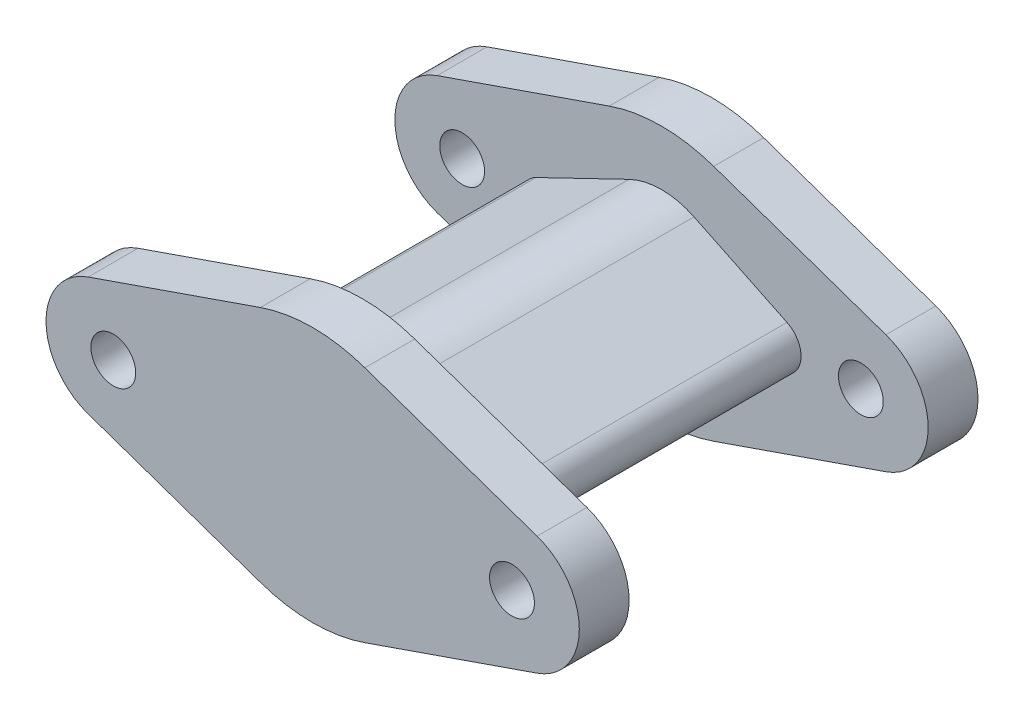
ISO-10303-21;
HEADER;
FILE_DESCRIPTION(('STEP AP214'),'2;1');
FILE_NAME('part.step','',(''),(''),'','','');
FILE_SCHEMA(('AUTOMOTIVE_DESIGN { 1 0 10303 214 1 1 1 1 }'));
ENDSEC;
DATA;
#1=APPLICATION_CONTEXT('core data for automotive mechanical design processes');
#2=APPLICATION_PROTOCOL_DEFINITION('international standard','automotive_design',2000,#1);
#3=PRODUCT_CONTEXT('',#1,'mechanical');
#4=PRODUCT('Part','Part','',(#3));
#5=PRODUCT_RELATED_PRODUCT_CATEGORY('part','',(#4));
#6=PRODUCT_DEFINITION_FORMATION('','',#4);
#7=PRODUCT_DEFINITION_CONTEXT('part definition',#1,'design');
#8=PRODUCT_DEFINITION('design','',#6,#7);
#9=PRODUCT_DEFINITION_SHAPE('','',#8);
#10=(LENGTH_UNIT() NAMED_UNIT(*) SI_UNIT(.MILLI.,.METRE.));
#11=(NAMED_UNIT(*) PLANE_ANGLE_UNIT() SI_UNIT($,.RADIAN.));
#12=(NAMED_UNIT(*) SI_UNIT($,.STERADIAN.) SOLID_ANGLE_UNIT());
#13=UNCERTAINTY_MEASURE_WITH_UNIT(LENGTH_MEASURE(1.E-05),#10,'distance_accuracy_value','');
#14=(GEOMETRIC_REPRESENTATION_CONTEXT(3) GLOBAL_UNCERTAINTY_ASSIGNED_CONTEXT((#13)) GLOBAL_UNIT_ASSIGNED_CONTEXT((#10,
#11,#12)) REPRESENTATION_CONTEXT('',''));
#15=CARTESIAN_POINT('',(0.,0.,0.));
#16=DIRECTION('',(0.,0.,1.));
#17=DIRECTION('',(1.,0.,0.));
#18=AXIS2_PLACEMENT_3D('',#15,#16,#17);
#19=CARTESIAN_POINT('',(0.,0.,40.));
#20=DIRECTION('',(0.,0.,-1.));
#21=DIRECTION('',(-1.,0.,0.));
#22=AXIS2_PLACEMENT_3D('',#19,#20,#21);
#23=PLANE('',#22);
#24=DIRECTION('',(0.944815710204536,-0.327602310356168,0.));
#25=VECTOR('',#24,1.);
#26=CARTESIAN_POINT('',(0.,-13.7592970349591,40.));
#27=LINE('',#26,#25);
#28=CARTESIAN_POINT('',(-22.5155207745943,-5.95233897428858,40.));
#29=VERTEX_POINT('',#28);
#30=CARTESIAN_POINT('',(-5.24163696569869,-11.9418289705897,40.));
#31=VERTEX_POINT('',#30);
#32=EDGE_CURVE('E178',#29,#31,#27,.T.);
#33=ORIENTED_EDGE('',*,*,#32,.T.);
#34=CARTESIAN_POINT('',(0.,3.17522239268286,40.));
#35=DIRECTION('',(0.,0.,-1.));
#36=DIRECTION('',(-1.,0.,0.));
#37=AXIS2_PLACEMENT_3D('',#34,#35,#36);
#38=CIRCLE('',#37,16.);
#39=CARTESIAN_POINT('',(5.24163696569869,-11.9418289705897,40.));
#40=VERTEX_POINT('',#39);
#41=EDGE_CURVE('E12',#31,#40,#38,.F.);
#42=ORIENTED_EDGE('',*,*,#41,.T.);
#43=DIRECTION('',(0.944815710204536,0.327602310356168,0.));
#44=VECTOR('',#43,1.);
#45=CARTESIAN_POINT('',(39.6822598285905,0.,40.));
#46=LINE('',#45,#44);
#47=CARTESIAN_POINT('',(22.5155207745943,-5.95233897428858,40.));
#48=VERTEX_POINT('',#47);
#49=EDGE_CURVE('E125',#40,#48,#46,.T.);
#50=ORIENTED_EDGE('',*,*,#49,.T.);
#51=CARTESIAN_POINT('',(20.4516262193505,0.,40.));
#52=DIRECTION('',(0.,0.,-1.));
#53=DIRECTION('',(-1.,0.,0.));
#54=AXIS2_PLACEMENT_3D('',#51,#52,#53);
#55=CIRCLE('',#54,6.3);
#56=CARTESIAN_POINT('',(22.5155207745943,5.95233897428857,40.));
#57=VERTEX_POINT('',#56);
#58=EDGE_CURVE('E146',#48,#57,#55,.F.);
#59=ORIENTED_EDGE('',*,*,#58,.T.);
#60=DIRECTION('',(-0.944815710204536,0.327602310356168,0.));
#61=VECTOR('',#60,1.);
#62=CARTESIAN_POINT('',(0.,13.7592970349591,40.));
#63=LINE('',#62,#61);
#64=CARTESIAN_POINT('',(5.24163696569869,11.9418289705897,40.));
#65=VERTEX_POINT('',#64);
#66=EDGE_CURVE('E124',#57,#65,#63,.T.);
#67=ORIENTED_EDGE('',*,*,#66,.T.);
#68=CARTESIAN_POINT('',(0.,-3.17522239268285,40.));
#69=DIRECTION('',(0.,0.,-1.));
#70=DIRECTION('',(-1.,0.,0.));
#71=AXIS2_PLACEMENT_3D('',#68,#69,#70);
#72=CIRCLE('',#71,16.);
#73=CARTESIAN_POINT('',(-5.24163696569869,11.9418289705897,40.));
#74=VERTEX_POINT('',#73);
#75=EDGE_CURVE('E165',#65,#74,#72,.F.);
#76=ORIENTED_EDGE('',*,*,#75,.T.);
#77=DIRECTION('',(-0.944815710204536,-0.327602310356168,0.));
#78=VECTOR('',#77,1.);
#79=CARTESIAN_POINT('',(-39.6822598285905,0.,40.));
#80=LINE('',#79,#78);
#81=CARTESIAN_POINT('',(-22.5155207745943,5.95233897428858,40.));
#82=VERTEX_POINT('',#81);
#83=EDGE_CURVE('E181',#74,#82,#80,.T.);
#84=ORIENTED_EDGE('',*,*,#83,.T.);
#85=CARTESIAN_POINT('',(-20.4516262193505,0.,40.));
#86=DIRECTION('',(0.,0.,-1.));
#87=DIRECTION('',(-1.,0.,0.));
#88=AXIS2_PLACEMENT_3D('',#85,#86,#87);
#89=CIRCLE('',#88,6.3);
#90=EDGE_CURVE('E157',#82,#29,#89,.F.);
#91=ORIENTED_EDGE('',*,*,#90,.T.);
#92=EDGE_LOOP('',(#33,#42,#50,#59,#67,#76,#84,#91));
#93=FACE_BOUND('',#92,.T.);
#94=CARTESIAN_POINT('',(20.,0.,40.));
#95=DIRECTION('',(0.,0.,-1.));
#96=DIRECTION('',(-1.,0.,0.));
#97=AXIS2_PLACEMENT_3D('',#94,#95,#96);
#98=CIRCLE('',#97,2.25);
#99=CARTESIAN_POINT('',(17.75,0.,40.));
#100=VERTEX_POINT('',#99);
#101=EDGE_CURVE('E188',#100,#100,#98,.T.);
#102=ORIENTED_EDGE('',*,*,#101,.T.);
#103=EDGE_LOOP('',(#102));
#104=FACE_BOUND('',#103,.T.);
#105=CARTESIAN_POINT('',(-20.,0.,40.));
#106=DIRECTION('',(0.,0.,1.));
#107=DIRECTION('',(1.,0.,0.));
#108=AXIS2_PLACEMENT_3D('',#105,#106,#107);
#109=CIRCLE('',#108,2.25);
#110=CARTESIAN_POINT('',(-17.75,0.,40.));
#111=VERTEX_POINT('',#110);
#112=EDGE_CURVE('E137',#111,#111,#109,.T.);
#113=ORIENTED_EDGE('',*,*,#112,.F.);
#114=EDGE_LOOP('',(#113));
#115=FACE_BOUND('',#114,.T.);
#116=ADVANCED_FACE('F42',(#93,#104,#115),#23,.F.);
#117=CARTESIAN_POINT('',(0.,0.,35.));
#118=DIRECTION('',(0.,0.,-1.));
#119=DIRECTION('',(-1.,0.,0.));
#120=AXIS2_PLACEMENT_3D('',#117,#118,#119);
#121=PLANE('',#120);
#122=CARTESIAN_POINT('',(20.,0.,35.));
#123=DIRECTION('',(0.,0.,-1.));
#124=DIRECTION('',(-1.,0.,0.));
#125=AXIS2_PLACEMENT_3D('',#122,#123,#124);
#126=CIRCLE('',#125,2.25);
#127=CARTESIAN_POINT('',(17.75,0.,35.));
#128=VERTEX_POINT('',#127);
#129=EDGE_CURVE('E185',#128,#128,#126,.T.);
#130=ORIENTED_EDGE('',*,*,#129,.F.);
#131=EDGE_LOOP('',(#130));
#132=FACE_BOUND('',#131,.T.);
#133=DIRECTION('',(0.944815710204536,0.327602310356168,0.));
#134=VECTOR('',#133,1.);
#135=CARTESIAN_POINT('',(39.6822598285905,0.,35.));
#136=LINE('',#135,#134);
#137=CARTESIAN_POINT('',(5.24163696569869,-11.9418289705897,35.));
#138=VERTEX_POINT('',#137);
#139=CARTESIAN_POINT('',(22.5155207745943,-5.95233897428858,35.));
#140=VERTEX_POINT('',#139);
#141=EDGE_CURVE('E143',#138,#140,#136,.T.);
#142=ORIENTED_EDGE('',*,*,#141,.F.);
#143=CARTESIAN_POINT('',(0.,3.17522239268286,35.));
#144=DIRECTION('',(0.,0.,-1.));
#145=DIRECTION('',(-1.,0.,0.));
#146=AXIS2_PLACEMENT_3D('',#143,#144,#145);
#147=CIRCLE('',#146,16.);
#148=CARTESIAN_POINT('',(-5.24163696569869,-11.9418289705897,35.));
#149=VERTEX_POINT('',#148);
#150=EDGE_CURVE('E64',#138,#149,#147,.T.);
#151=ORIENTED_EDGE('',*,*,#150,.T.);
#152=DIRECTION('',(0.944815710204536,-0.327602310356168,0.));
#153=VECTOR('',#152,1.);
#154=CARTESIAN_POINT('',(0.,-13.7592970349591,35.));
#155=LINE('',#154,#153);
#156=CARTESIAN_POINT('',(-22.5155207745943,-5.95233897428858,35.));
#157=VERTEX_POINT('',#156);
#158=EDGE_CURVE('E134',#157,#149,#155,.T.);
#159=ORIENTED_EDGE('',*,*,#158,.F.);
#160=CARTESIAN_POINT('',(-20.4516262193505,0.,35.));
#161=DIRECTION('',(0.,0.,-1.));
#162=DIRECTION('',(-1.,0.,0.));
#163=AXIS2_PLACEMENT_3D('',#160,#161,#162);
#164=CIRCLE('',#163,6.3);
#165=CARTESIAN_POINT('',(-22.5155207745943,5.95233897428858,35.));
#166=VERTEX_POINT('',#165);
#167=EDGE_CURVE('E151',#157,#166,#164,.T.);
#168=ORIENTED_EDGE('',*,*,#167,.T.);
#169=DIRECTION('',(-0.944815710204536,-0.327602310356168,0.));
#170=VECTOR('',#169,1.);
#171=CARTESIAN_POINT('',(-39.6822598285905,0.,35.));
#172=LINE('',#171,#170);
#173=CARTESIAN_POINT('',(-5.24163696569869,11.9418289705897,35.));
#174=VERTEX_POINT('',#173);
#175=EDGE_CURVE('E131',#174,#166,#172,.T.);
#176=ORIENTED_EDGE('',*,*,#175,.F.);
#177=CARTESIAN_POINT('',(0.,-3.17522239268285,35.));
#178=DIRECTION('',(0.,0.,-1.));
#179=DIRECTION('',(-1.,0.,0.));
#180=AXIS2_PLACEMENT_3D('',#177,#178,#179);
#181=CIRCLE('',#180,16.);
#182=CARTESIAN_POINT('',(5.24163696569869,11.9418289705897,35.));
#183=VERTEX_POINT('',#182);
#184=EDGE_CURVE('E130',#174,#183,#181,.T.);
#185=ORIENTED_EDGE('',*,*,#184,.T.);
#186=DIRECTION('',(-0.944815710204536,0.327602310356168,0.));
#187=VECTOR('',#186,1.);
#188=CARTESIAN_POINT('',(0.,13.7592970349591,35.));
#189=LINE('',#188,#187);
#190=CARTESIAN_POINT('',(22.5155207745943,5.95233897428857,35.));
#191=VERTEX_POINT('',#190);
#192=EDGE_CURVE('E121',#191,#183,#189,.T.);
#193=ORIENTED_EDGE('',*,*,#192,.F.);
#194=CARTESIAN_POINT('',(20.4516262193505,0.,35.));
#195=DIRECTION('',(0.,0.,-1.));
#196=DIRECTION('',(-1.,0.,0.));
#197=AXIS2_PLACEMENT_3D('',#194,#195,#196);
#198=CIRCLE('',#197,6.3);
#199=EDGE_CURVE('E108',#191,#140,#198,.T.);
#200=ORIENTED_EDGE('',*,*,#199,.T.);
#201=EDGE_LOOP('',(#142,#151,#159,#168,#176,#185,#193,#200));
#202=FACE_BOUND('',#201,.T.);
#203=CARTESIAN_POINT('',(-20.,0.,35.));
#204=DIRECTION('',(0.,0.,1.));
#205=DIRECTION('',(1.,0.,0.));
#206=AXIS2_PLACEMENT_3D('',#203,#204,#205);
#207=CIRCLE('',#206,2.25);
#208=CARTESIAN_POINT('',(-17.75,0.,35.));
#209=VERTEX_POINT('',#208);
#210=EDGE_CURVE('E132',#209,#209,#207,.T.);
#211=ORIENTED_EDGE('',*,*,#210,.T.);
#212=EDGE_LOOP('',(#211));
#213=FACE_BOUND('',#212,.T.);
#214=ADVANCED_FACE('F127',(#132,#202,#213),#121,.T.);
#215=CARTESIAN_POINT('',(0.,13.7592970349591,40.));
#216=DIRECTION('',(-0.327602310356168,-0.944815710204535,0.));
#217=DIRECTION('',(0.944815710204536,-0.327602310356168,0.));
#218=AXIS2_PLACEMENT_3D('',#215,#216,#217);
#219=PLANE('',#218);
#220=ORIENTED_EDGE('',*,*,#192,.T.);
#221=DIRECTION('',(0.,0.,-1.));
#222=VECTOR('',#221,1.);
#223=CARTESIAN_POINT('',(5.24163696569869,11.9418289705897,40.));
#224=LINE('',#223,#222);
#225=EDGE_CURVE('E163',#183,#65,#224,.F.);
#226=ORIENTED_EDGE('',*,*,#225,.T.);
#227=ORIENTED_EDGE('',*,*,#66,.F.);
#228=DIRECTION('',(0.,0.,-1.));
#229=VECTOR('',#228,1.);
#230=CARTESIAN_POINT('',(22.5155207745943,5.95233897428857,40.));
#231=LINE('',#230,#229);
#232=EDGE_CURVE('E112',#57,#191,#231,.T.);
#233=ORIENTED_EDGE('',*,*,#232,.T.);
#234=EDGE_LOOP('',(#220,#226,#227,#233));
#235=FACE_BOUND('',#234,.T.);
#236=ADVANCED_FACE('F120',(#235),#219,.F.);
#237=CARTESIAN_POINT('',(-39.6822598285905,0.,40.));
#238=DIRECTION('',(0.327602310356168,-0.944815710204535,0.));
#239=DIRECTION('',(0.944815710204536,0.327602310356168,0.));
#240=AXIS2_PLACEMENT_3D('',#237,#238,#239);
#241=PLANE('',#240);
#242=ORIENTED_EDGE('',*,*,#83,.F.);
#243=DIRECTION('',(0.,0.,-1.));
#244=VECTOR('',#243,1.);
#245=CARTESIAN_POINT('',(-5.24163696569869,11.9418289705897,40.));
#246=LINE('',#245,#244);
#247=EDGE_CURVE('E159',#74,#174,#246,.T.);
#248=ORIENTED_EDGE('',*,*,#247,.T.);
#249=ORIENTED_EDGE('',*,*,#175,.T.);
#250=DIRECTION('',(0.,0.,-1.));
#251=VECTOR('',#250,1.);
#252=CARTESIAN_POINT('',(-22.5155207745943,5.95233897428858,40.));
#253=LINE('',#252,#251);
#254=EDGE_CURVE('E154',#166,#82,#253,.F.);
#255=ORIENTED_EDGE('',*,*,#254,.T.);
#256=EDGE_LOOP('',(#242,#248,#249,#255));
#257=FACE_BOUND('',#256,.T.);
#258=ADVANCED_FACE('F212',(#257),#241,.F.);
#259=CARTESIAN_POINT('',(0.,-13.7592970349591,40.));
#260=DIRECTION('',(0.327602310356168,0.944815710204536,0.));
#261=DIRECTION('',(-0.944815710204536,0.327602310356168,0.));
#262=AXIS2_PLACEMENT_3D('',#259,#260,#261);
#263=PLANE('',#262);
#264=ORIENTED_EDGE('',*,*,#158,.T.);
#265=DIRECTION('',(0.,0.,-1.));
#266=VECTOR('',#265,1.);
#267=CARTESIAN_POINT('',(-5.24163696569869,-11.9418289705897,40.));
#268=LINE('',#267,#266);
#269=EDGE_CURVE('E50',#149,#31,#268,.F.);
#270=ORIENTED_EDGE('',*,*,#269,.T.);
#271=ORIENTED_EDGE('',*,*,#32,.F.);
#272=DIRECTION('',(0.,0.,-1.));
#273=VECTOR('',#272,1.);
#274=CARTESIAN_POINT('',(-22.5155207745943,-5.95233897428858,40.));
#275=LINE('',#274,#273);
#276=EDGE_CURVE('E148',#29,#157,#275,.T.);
#277=ORIENTED_EDGE('',*,*,#276,.T.);
#278=EDGE_LOOP('',(#264,#270,#271,#277));
#279=FACE_BOUND('',#278,.T.);
#280=ADVANCED_FACE('F209',(#279),#263,.F.);
#281=CARTESIAN_POINT('',(39.6822598285905,0.,40.));
#282=DIRECTION('',(-0.327602310356168,0.944815710204536,0.));
#283=DIRECTION('',(-0.944815710204536,-0.327602310356168,0.));
#284=AXIS2_PLACEMENT_3D('',#281,#282,#283);
#285=PLANE('',#284);
#286=ORIENTED_EDGE('',*,*,#49,.F.);
#287=DIRECTION('',(0.,0.,-1.));
#288=VECTOR('',#287,1.);
#289=CARTESIAN_POINT('',(5.24163696569868,-11.9418289705897,40.));
#290=LINE('',#289,#288);
#291=EDGE_CURVE('E167',#40,#138,#290,.T.);
#292=ORIENTED_EDGE('',*,*,#291,.T.);
#293=ORIENTED_EDGE('',*,*,#141,.T.);
#294=DIRECTION('',(0.,0.,-1.));
#295=VECTOR('',#294,1.);
#296=CARTESIAN_POINT('',(22.5155207745943,-5.95233897428858,40.));
#297=LINE('',#296,#295);
#298=EDGE_CURVE('E114',#140,#48,#297,.F.);
#299=ORIENTED_EDGE('',*,*,#298,.T.);
#300=EDGE_LOOP('',(#286,#292,#293,#299));
#301=FACE_BOUND('',#300,.T.);
#302=ADVANCED_FACE('F173',(#301),#285,.F.);
#303=CARTESIAN_POINT('',(20.4516262193505,0.,40.));
#304=DIRECTION('',(0.,0.,-1.));
#305=DIRECTION('',(-1.,0.,0.));
#306=AXIS2_PLACEMENT_3D('',#303,#304,#305);
#307=CYLINDRICAL_SURFACE('',#306,6.3);
#308=ORIENTED_EDGE('',*,*,#58,.F.);
#309=ORIENTED_EDGE('',*,*,#298,.F.);
#310=ORIENTED_EDGE('',*,*,#199,.F.);
#311=ORIENTED_EDGE('',*,*,#232,.F.);
#312=EDGE_LOOP('',(#308,#309,#310,#311));
#313=FACE_BOUND('',#312,.T.);
#314=ADVANCED_FACE('F111',(#313),#307,.T.);
#315=CARTESIAN_POINT('',(-20.4516262193505,0.,40.));
#316=DIRECTION('',(0.,0.,-1.));
#317=DIRECTION('',(-1.,0.,0.));
#318=AXIS2_PLACEMENT_3D('',#315,#316,#317);
#319=CYLINDRICAL_SURFACE('',#318,6.3);
#320=ORIENTED_EDGE('',*,*,#90,.F.);
#321=ORIENTED_EDGE('',*,*,#254,.F.);
#322=ORIENTED_EDGE('',*,*,#167,.F.);
#323=ORIENTED_EDGE('',*,*,#276,.F.);
#324=EDGE_LOOP('',(#320,#321,#322,#323));
#325=FACE_BOUND('',#324,.T.);
#326=ADVANCED_FACE('F220',(#325),#319,.T.);
#327=CARTESIAN_POINT('',(0.,-3.17522239268285,40.));
#328=DIRECTION('',(0.,0.,-1.));
#329=DIRECTION('',(-1.,0.,0.));
#330=AXIS2_PLACEMENT_3D('',#327,#328,#329);
#331=CYLINDRICAL_SURFACE('',#330,16.);
#332=ORIENTED_EDGE('',*,*,#75,.F.);
#333=ORIENTED_EDGE('',*,*,#225,.F.);
#334=ORIENTED_EDGE('',*,*,#184,.F.);
#335=ORIENTED_EDGE('',*,*,#247,.F.);
#336=EDGE_LOOP('',(#332,#333,#334,#335));
#337=FACE_BOUND('',#336,.T.);
#338=ADVANCED_FACE('F222',(#337),#331,.T.);
#339=CARTESIAN_POINT('',(0.,3.17522239268286,40.));
#340=DIRECTION('',(0.,0.,-1.));
#341=DIRECTION('',(-1.,0.,0.));
#342=AXIS2_PLACEMENT_3D('',#339,#340,#341);
#343=CYLINDRICAL_SURFACE('',#342,16.);
#344=ORIENTED_EDGE('',*,*,#41,.F.);
#345=ORIENTED_EDGE('',*,*,#269,.F.);
#346=ORIENTED_EDGE('',*,*,#150,.F.);
#347=ORIENTED_EDGE('',*,*,#291,.F.);
#348=EDGE_LOOP('',(#344,#345,#346,#347));
#349=FACE_BOUND('',#348,.T.);
#350=ADVANCED_FACE('F44',(#349),#343,.T.);
#351=CARTESIAN_POINT('',(20.,0.,35.));
#352=DIRECTION('',(0.,0.,1.));
#353=DIRECTION('',(1.,0.,0.));
#354=AXIS2_PLACEMENT_3D('',#351,#352,#353);
#355=CYLINDRICAL_SURFACE('',#354,2.25);
#356=ORIENTED_EDGE('',*,*,#129,.T.);
#357=EDGE_LOOP('',(#356));
#358=FACE_BOUND('',#357,.T.);
#359=ORIENTED_EDGE('',*,*,#101,.F.);
#360=EDGE_LOOP('',(#359));
#361=FACE_BOUND('',#360,.T.);
#362=ADVANCED_FACE('F204',(#358,#361),#355,.F.);
#363=CARTESIAN_POINT('',(-20.,0.,35.));
#364=DIRECTION('',(0.,0.,1.));
#365=DIRECTION('',(1.,0.,0.));
#366=AXIS2_PLACEMENT_3D('',#363,#364,#365);
#367=CYLINDRICAL_SURFACE('',#366,2.25);
#368=ORIENTED_EDGE('',*,*,#210,.F.);
#369=EDGE_LOOP('',(#368));
#370=FACE_BOUND('',#369,.T.);
#371=ORIENTED_EDGE('',*,*,#112,.T.);
#372=EDGE_LOOP('',(#371));
#373=FACE_BOUND('',#372,.T.);
#374=ADVANCED_FACE('F194',(#370,#373),#367,.F.);
#375=CLOSED_SHELL('',(#116,#214,#236,#258,#280,#302,#314,#326,#338,#350,#362,#374));
#376=MANIFOLD_SOLID_BREP('B2',#375);
#377=CARTESIAN_POINT('',(0.,0.,5.));
#378=DIRECTION('',(0.,0.,-1.));
#379=DIRECTION('',(-1.,0.,0.));
#380=AXIS2_PLACEMENT_3D('',#377,#378,#379);
#381=PLANE('',#380);
#382=CARTESIAN_POINT('',(-20.,0.,5.));
#383=DIRECTION('',(0.,0.,1.));
#384=DIRECTION('',(1.,0.,0.));
#385=AXIS2_PLACEMENT_3D('',#382,#383,#384);
#386=CIRCLE('',#385,2.25);
#387=CARTESIAN_POINT('',(-17.75,0.,5.));
#388=VERTEX_POINT('',#387);
#389=EDGE_CURVE('E460',#388,#388,#386,.T.);
#390=ORIENTED_EDGE('',*,*,#389,.F.);
#391=EDGE_LOOP('',(#390));
#392=FACE_BOUND('',#391,.T.);
#393=CARTESIAN_POINT('',(20.,0.,5.));
#394=DIRECTION('',(0.,0.,-1.));
#395=DIRECTION('',(-1.,0.,0.));
#396=AXIS2_PLACEMENT_3D('',#393,#394,#395);
#397=CIRCLE('',#396,2.25);
#398=CARTESIAN_POINT('',(17.75,0.,5.));
#399=VERTEX_POINT('',#398);
#400=EDGE_CURVE('E463',#399,#399,#397,.T.);
#401=ORIENTED_EDGE('',*,*,#400,.T.);
#402=EDGE_LOOP('',(#401));
#403=FACE_BOUND('',#402,.T.);
#404=DIRECTION('',(0.944815710204536,-0.327602310356168,0.));
#405=VECTOR('',#404,1.);
#406=CARTESIAN_POINT('',(0.,-13.7592970349591,5.));
#407=LINE('',#406,#405);
#408=CARTESIAN_POINT('',(-22.5155207745943,-5.95233897428858,5.));
#409=VERTEX_POINT('',#408);
#410=CARTESIAN_POINT('',(-5.24163696569869,-11.9418289705897,5.));
#411=VERTEX_POINT('',#410);
#412=EDGE_CURVE('E475',#409,#411,#407,.T.);
#413=ORIENTED_EDGE('',*,*,#412,.T.);
#414=CARTESIAN_POINT('',(0.,3.17522239268286,5.));
#415=DIRECTION('',(0.,0.,-1.));
#416=DIRECTION('',(-1.,0.,0.));
#417=AXIS2_PLACEMENT_3D('',#414,#415,#416);
#418=CIRCLE('',#417,16.);
#419=CARTESIAN_POINT('',(5.24163696569869,-11.9418289705897,5.));
#420=VERTEX_POINT('',#419);
#421=EDGE_CURVE('E40',#411,#420,#418,.F.);
#422=ORIENTED_EDGE('',*,*,#421,.T.);
#423=DIRECTION('',(0.944815710204536,0.327602310356168,0.));
#424=VECTOR('',#423,1.);
#425=CARTESIAN_POINT('',(39.6822598285905,0.,5.));
#426=LINE('',#425,#424);
#427=CARTESIAN_POINT('',(22.5155207745943,-5.95233897428858,5.));
#428=VERTEX_POINT('',#427);
#429=EDGE_CURVE('E478',#420,#428,#426,.T.);
#430=ORIENTED_EDGE('',*,*,#429,.T.);
#431=CARTESIAN_POINT('',(20.4516262193505,0.,5.));
#432=DIRECTION('',(0.,0.,-1.));
#433=DIRECTION('',(-1.,0.,0.));
#434=AXIS2_PLACEMENT_3D('',#431,#432,#433);
#435=CIRCLE('',#434,6.3);
#436=CARTESIAN_POINT('',(22.5155207745943,5.95233897428857,5.));
#437=VERTEX_POINT('',#436);
#438=EDGE_CURVE('E497',#428,#437,#435,.F.);
#439=ORIENTED_EDGE('',*,*,#438,.T.);
#440=DIRECTION('',(-0.944815710204536,0.327602310356168,0.));
#441=VECTOR('',#440,1.);
#442=CARTESIAN_POINT('',(0.,13.7592970349591,5.));
#443=LINE('',#442,#441);
#444=CARTESIAN_POINT('',(5.24163696569869,11.9418289705897,5.));
#445=VERTEX_POINT('',#444);
#446=EDGE_CURVE('E469',#437,#445,#443,.T.);
#447=ORIENTED_EDGE('',*,*,#446,.T.);
#448=CARTESIAN_POINT('',(0.,-3.17522239268285,5.));
#449=DIRECTION('',(0.,0.,-1.));
#450=DIRECTION('',(-1.,0.,0.));
#451=AXIS2_PLACEMENT_3D('',#448,#449,#450);
#452=CIRCLE('',#451,16.);
#453=CARTESIAN_POINT('',(-5.24163696569869,11.9418289705897,5.));
#454=VERTEX_POINT('',#453);
#455=EDGE_CURVE('E517',#445,#454,#452,.F.);
#456=ORIENTED_EDGE('',*,*,#455,.T.);
#457=DIRECTION('',(-0.944815710204536,-0.327602310356168,0.));
#458=VECTOR('',#457,1.);
#459=CARTESIAN_POINT('',(-39.6822598285905,0.,5.));
#460=LINE('',#459,#458);
#461=CARTESIAN_POINT('',(-22.5155207745943,5.95233897428858,5.));
#462=VERTEX_POINT('',#461);
#463=EDGE_CURVE('E472',#454,#462,#460,.T.);
#464=ORIENTED_EDGE('',*,*,#463,.T.);
#465=CARTESIAN_POINT('',(-20.4516262193505,0.,5.));
#466=DIRECTION('',(0.,0.,-1.));
#467=DIRECTION('',(-1.,0.,0.));
#468=AXIS2_PLACEMENT_3D('',#465,#466,#467);
#469=CIRCLE('',#468,6.3);
#470=EDGE_CURVE('E508',#462,#409,#469,.F.);
#471=ORIENTED_EDGE('',*,*,#470,.T.);
#472=EDGE_LOOP('',(#413,#422,#430,#439,#447,#456,#464,#471));
#473=FACE_BOUND('',#472,.T.);
#474=CARTESIAN_POINT('',(0.,-0.189162231974294,5.));
#475=DIRECTION('',(0.,0.,1.));
#476=DIRECTION('',(1.,0.,0.));
#477=AXIS2_PLACEMENT_3D('',#474,#475,#476);
#478=CIRCLE('',#477,7.5);
#479=CARTESIAN_POINT('',(-3.26086956521739,-6.94317805062907,5.));
#480=VERTEX_POINT('',#479);
#481=CARTESIAN_POINT('',(3.26086956521739,-6.94317805062907,5.));
#482=VERTEX_POINT('',#481);
#483=EDGE_CURVE('E326',#480,#482,#478,.T.);
#484=ORIENTED_EDGE('',*,*,#483,.F.);
#485=DIRECTION('',(-0.900535442487303,0.434782608695652,0.));
#486=VECTOR('',#485,1.);
#487=CARTESIAN_POINT('',(-3.26086956521739,-6.94317805062907,5.));
#488=LINE('',#487,#486);
#489=CARTESIAN_POINT('',(-12.5869565217391,-2.44050083819256,5.));
#490=VERTEX_POINT('',#489);
#491=EDGE_CURVE('E331',#480,#490,#488,.T.);
#492=ORIENTED_EDGE('',*,*,#491,.T.);
#493=CARTESIAN_POINT('',(-11.5,-0.189162231974294,5.));
#494=DIRECTION('',(0.,0.,1.));
#495=DIRECTION('',(1.,0.,0.));
#496=AXIS2_PLACEMENT_3D('',#493,#494,#495);
#497=CIRCLE('',#496,2.5);
#498=CARTESIAN_POINT('',(-12.5869565217391,2.06217637424397,5.));
#499=VERTEX_POINT('',#498);
#500=EDGE_CURVE('E446',#499,#490,#497,.T.);
#501=ORIENTED_EDGE('',*,*,#500,.F.);
#502=DIRECTION('',(-0.900535442487303,-0.434782608695652,0.));
#503=VECTOR('',#502,1.);
#504=CARTESIAN_POINT('',(-3.26086956521739,6.56485358668048,5.));
#505=LINE('',#504,#503);
#506=CARTESIAN_POINT('',(-3.26086956521739,6.56485358668048,5.));
#507=VERTEX_POINT('',#506);
#508=EDGE_CURVE('E744',#507,#499,#505,.T.);
#509=ORIENTED_EDGE('',*,*,#508,.F.);
#510=CARTESIAN_POINT('',(0.,-0.189162231974294,5.));
#511=DIRECTION('',(0.,0.,1.));
#512=DIRECTION('',(1.,0.,0.));
#513=AXIS2_PLACEMENT_3D('',#510,#511,#512);
#514=CIRCLE('',#513,7.5);
#515=CARTESIAN_POINT('',(3.26086956521739,6.56485358668049,5.));
#516=VERTEX_POINT('',#515);
#517=EDGE_CURVE('E746',#516,#507,#514,.T.);
#518=ORIENTED_EDGE('',*,*,#517,.F.);
#519=DIRECTION('',(0.900535442487303,-0.434782608695652,0.));
#520=VECTOR('',#519,1.);
#521=CARTESIAN_POINT('',(3.26086956521739,6.56485358668048,5.));
#522=LINE('',#521,#520);
#523=CARTESIAN_POINT('',(12.5869565217391,2.06217637424397,5.));
#524=VERTEX_POINT('',#523);
#525=EDGE_CURVE('E768',#516,#524,#522,.T.);
#526=ORIENTED_EDGE('',*,*,#525,.T.);
#527=CARTESIAN_POINT('',(11.5,-0.189162231974291,5.));
#528=DIRECTION('',(0.,0.,-1.));
#529=DIRECTION('',(-1.,0.,0.));
#530=AXIS2_PLACEMENT_3D('',#527,#528,#529);
#531=CIRCLE('',#530,2.5);
#532=CARTESIAN_POINT('',(12.5869565217391,-2.44050083819255,5.));
#533=VERTEX_POINT('',#532);
#534=EDGE_CURVE('E769',#524,#533,#531,.T.);
#535=ORIENTED_EDGE('',*,*,#534,.T.);
#536=DIRECTION('',(0.900535442487303,0.434782608695652,0.));
#537=VECTOR('',#536,1.);
#538=CARTESIAN_POINT('',(3.26086956521739,-6.94317805062907,5.));
#539=LINE('',#538,#537);
#540=EDGE_CURVE('E773',#482,#533,#539,.T.);
#541=ORIENTED_EDGE('',*,*,#540,.F.);
#542=EDGE_LOOP('',(#484,#492,#501,#509,#518,#526,#535,#541));
#543=FACE_BOUND('',#542,.T.);
#544=ADVANCED_FACE('F311',(#392,#403,#473,#543),#381,.F.);
#545=CARTESIAN_POINT('',(0.,0.,0.));
#546=DIRECTION('',(0.,0.,-1.));
#547=DIRECTION('',(-1.,0.,0.));
#548=AXIS2_PLACEMENT_3D('',#545,#546,#547);
#549=PLANE('',#548);
#550=CARTESIAN_POINT('',(20.,0.,0.));
#551=DIRECTION('',(0.,0.,-1.));
#552=DIRECTION('',(-1.,0.,0.));
#553=AXIS2_PLACEMENT_3D('',#550,#551,#552);
#554=CIRCLE('',#553,2.25);
#555=CARTESIAN_POINT('',(17.75,0.,0.));
#556=VERTEX_POINT('',#555);
#557=EDGE_CURVE('E466',#556,#556,#554,.T.);
#558=ORIENTED_EDGE('',*,*,#557,.F.);
#559=EDGE_LOOP('',(#558));
#560=FACE_BOUND('',#559,.T.);
#561=DIRECTION('',(0.944815710204536,0.327602310356168,0.));
#562=VECTOR('',#561,1.);
#563=CARTESIAN_POINT('',(39.6822598285905,0.,0.));
#564=LINE('',#563,#562);
#565=CARTESIAN_POINT('',(5.24163696569869,-11.9418289705897,0.));
#566=VERTEX_POINT('',#565);
#567=CARTESIAN_POINT('',(22.5155207745943,-5.95233897428858,0.));
#568=VERTEX_POINT('',#567);
#569=EDGE_CURVE('E473',#566,#568,#564,.T.);
#570=ORIENTED_EDGE('',*,*,#569,.F.);
#571=CARTESIAN_POINT('',(0.,3.17522239268286,0.));
#572=DIRECTION('',(0.,0.,-1.));
#573=DIRECTION('',(-1.,0.,0.));
#574=AXIS2_PLACEMENT_3D('',#571,#572,#573);
#575=CIRCLE('',#574,16.);
#576=CARTESIAN_POINT('',(-5.24163696569869,-11.9418289705897,0.));
#577=VERTEX_POINT('',#576);
#578=EDGE_CURVE('E522',#566,#577,#575,.T.);
#579=ORIENTED_EDGE('',*,*,#578,.T.);
#580=DIRECTION('',(0.944815710204536,-0.327602310356168,0.));
#581=VECTOR('',#580,1.);
#582=CARTESIAN_POINT('',(0.,-13.7592970349591,0.));
#583=LINE('',#582,#581);
#584=CARTESIAN_POINT('',(-22.5155207745943,-5.95233897428858,0.));
#585=VERTEX_POINT('',#584);
#586=EDGE_CURVE('E485',#585,#577,#583,.T.);
#587=ORIENTED_EDGE('',*,*,#586,.F.);
#588=CARTESIAN_POINT('',(-20.4516262193505,0.,0.));
#589=DIRECTION('',(0.,0.,-1.));
#590=DIRECTION('',(-1.,0.,0.));
#591=AXIS2_PLACEMENT_3D('',#588,#589,#590);
#592=CIRCLE('',#591,6.3);
#593=CARTESIAN_POINT('',(-22.5155207745943,5.95233897428858,0.));
#594=VERTEX_POINT('',#593);
#595=EDGE_CURVE('E502',#585,#594,#592,.T.);
#596=ORIENTED_EDGE('',*,*,#595,.T.);
#597=DIRECTION('',(-0.944815710204536,-0.327602310356168,0.));
#598=VECTOR('',#597,1.);
#599=CARTESIAN_POINT('',(-39.6822598285905,0.,0.));
#600=LINE('',#599,#598);
#601=CARTESIAN_POINT('',(-5.24163696569869,11.9418289705897,0.));
#602=VERTEX_POINT('',#601);
#603=EDGE_CURVE('E483',#602,#594,#600,.T.);
#604=ORIENTED_EDGE('',*,*,#603,.F.);
#605=CARTESIAN_POINT('',(0.,-3.17522239268285,0.));
#606=DIRECTION('',(0.,0.,-1.));
#607=DIRECTION('',(-1.,0.,0.));
#608=AXIS2_PLACEMENT_3D('',#605,#606,#607);
#609=CIRCLE('',#608,16.);
#610=CARTESIAN_POINT('',(5.24163696569869,11.9418289705897,0.));
#611=VERTEX_POINT('',#610);
#612=EDGE_CURVE('E513',#602,#611,#609,.T.);
#613=ORIENTED_EDGE('',*,*,#612,.T.);
#614=DIRECTION('',(-0.944815710204536,0.327602310356168,0.));
#615=VECTOR('',#614,1.);
#616=CARTESIAN_POINT('',(0.,13.7592970349591,0.));
#617=LINE('',#616,#615);
#618=CARTESIAN_POINT('',(22.5155207745943,5.95233897428857,0.));
#619=VERTEX_POINT('',#618);
#620=EDGE_CURVE('E459',#619,#611,#617,.T.);
#621=ORIENTED_EDGE('',*,*,#620,.F.);
#622=CARTESIAN_POINT('',(20.4516262193505,0.,0.));
#623=DIRECTION('',(0.,0.,-1.));
#624=DIRECTION('',(-1.,0.,0.));
#625=AXIS2_PLACEMENT_3D('',#622,#623,#624);
#626=CIRCLE('',#625,6.3);
#627=EDGE_CURVE('E491',#619,#568,#626,.T.);
#628=ORIENTED_EDGE('',*,*,#627,.T.);
#629=EDGE_LOOP('',(#570,#579,#587,#596,#604,#613,#621,#628));
#630=FACE_BOUND('',#629,.T.);
#631=CARTESIAN_POINT('',(-20.,0.,0.));
#632=DIRECTION('',(0.,0.,1.));
#633=DIRECTION('',(1.,0.,0.));
#634=AXIS2_PLACEMENT_3D('',#631,#632,#633);
#635=CIRCLE('',#634,2.25);
#636=CARTESIAN_POINT('',(-17.75,0.,0.));
#637=VERTEX_POINT('',#636);
#638=EDGE_CURVE('E456',#637,#637,#635,.T.);
#639=ORIENTED_EDGE('',*,*,#638,.T.);
#640=EDGE_LOOP('',(#639));
#641=FACE_BOUND('',#640,.T.);
#642=ADVANCED_FACE('F539',(#560,#630,#641),#549,.T.);
#643=CARTESIAN_POINT('',(0.,13.7592970349591,5.));
#644=DIRECTION('',(-0.327602310356168,-0.944815710204535,0.));
#645=DIRECTION('',(0.944815710204536,-0.327602310356168,0.));
#646=AXIS2_PLACEMENT_3D('',#643,#644,#645);
#647=PLANE('',#646);
#648=ORIENTED_EDGE('',*,*,#620,.T.);
#649=DIRECTION('',(0.,0.,-1.));
#650=VECTOR('',#649,1.);
#651=CARTESIAN_POINT('',(5.24163696569869,11.9418289705897,5.));
#652=LINE('',#651,#650);
#653=EDGE_CURVE('E515',#611,#445,#652,.F.);
#654=ORIENTED_EDGE('',*,*,#653,.T.);
#655=ORIENTED_EDGE('',*,*,#446,.F.);
#656=DIRECTION('',(0.,0.,-1.));
#657=VECTOR('',#656,1.);
#658=CARTESIAN_POINT('',(22.5155207745943,5.95233897428857,5.));
#659=LINE('',#658,#657);
#660=EDGE_CURVE('E480',#437,#619,#659,.T.);
#661=ORIENTED_EDGE('',*,*,#660,.T.);
#662=EDGE_LOOP('',(#648,#654,#655,#661));
#663=FACE_BOUND('',#662,.T.);
#664=ADVANCED_FACE('F550',(#663),#647,.F.);
#665=CARTESIAN_POINT('',(-39.6822598285905,0.,5.));
#666=DIRECTION('',(0.327602310356168,-0.944815710204535,0.));
#667=DIRECTION('',(0.944815710204536,0.327602310356168,0.));
#668=AXIS2_PLACEMENT_3D('',#665,#666,#667);
#669=PLANE('',#668);
#670=ORIENTED_EDGE('',*,*,#463,.F.);
#671=DIRECTION('',(0.,0.,-1.));
#672=VECTOR('',#671,1.);
#673=CARTESIAN_POINT('',(-5.24163696569869,11.9418289705897,5.));
#674=LINE('',#673,#672);
#675=EDGE_CURVE('E510',#454,#602,#674,.T.);
#676=ORIENTED_EDGE('',*,*,#675,.T.);
#677=ORIENTED_EDGE('',*,*,#603,.T.);
#678=DIRECTION('',(0.,0.,-1.));
#679=VECTOR('',#678,1.);
#680=CARTESIAN_POINT('',(-22.5155207745943,5.95233897428858,5.));
#681=LINE('',#680,#679);
#682=EDGE_CURVE('E505',#594,#462,#681,.F.);
#683=ORIENTED_EDGE('',*,*,#682,.T.);
#684=EDGE_LOOP('',(#670,#676,#677,#683));
#685=FACE_BOUND('',#684,.T.);
#686=ADVANCED_FACE('F557',(#685),#669,.F.);
#687=CARTESIAN_POINT('',(0.,-13.7592970349591,5.));
#688=DIRECTION('',(0.327602310356168,0.944815710204536,0.));
#689=DIRECTION('',(-0.944815710204536,0.327602310356168,0.));
#690=AXIS2_PLACEMENT_3D('',#687,#688,#689);
#691=PLANE('',#690);
#692=ORIENTED_EDGE('',*,*,#586,.T.);
#693=DIRECTION('',(0.,0.,-1.));
#694=VECTOR('',#693,1.);
#695=CARTESIAN_POINT('',(-5.24163696569869,-11.9418289705897,5.));
#696=LINE('',#695,#694);
#697=EDGE_CURVE('E319',#577,#411,#696,.F.);
#698=ORIENTED_EDGE('',*,*,#697,.T.);
#699=ORIENTED_EDGE('',*,*,#412,.F.);
#700=DIRECTION('',(0.,0.,-1.));
#701=VECTOR('',#700,1.);
#702=CARTESIAN_POINT('',(-22.5155207745943,-5.95233897428858,5.));
#703=LINE('',#702,#701);
#704=EDGE_CURVE('E499',#409,#585,#703,.T.);
#705=ORIENTED_EDGE('',*,*,#704,.T.);
#706=EDGE_LOOP('',(#692,#698,#699,#705));
#707=FACE_BOUND('',#706,.T.);
#708=ADVANCED_FACE('F526',(#707),#691,.F.);
#709=CARTESIAN_POINT('',(39.6822598285905,0.,5.));
#710=DIRECTION('',(-0.327602310356168,0.944815710204536,0.));
#711=DIRECTION('',(-0.944815710204536,-0.327602310356168,0.));
#712=AXIS2_PLACEMENT_3D('',#709,#710,#711);
#713=PLANE('',#712);
#714=ORIENTED_EDGE('',*,*,#429,.F.);
#715=DIRECTION('',(0.,0.,-1.));
#716=VECTOR('',#715,1.);
#717=CARTESIAN_POINT('',(5.24163696569868,-11.9418289705897,5.));
#718=LINE('',#717,#716);
#719=EDGE_CURVE('E519',#420,#566,#718,.T.);
#720=ORIENTED_EDGE('',*,*,#719,.T.);
#721=ORIENTED_EDGE('',*,*,#569,.T.);
#722=DIRECTION('',(0.,0.,-1.));
#723=VECTOR('',#722,1.);
#724=CARTESIAN_POINT('',(22.5155207745943,-5.95233897428858,5.));
#725=LINE('',#724,#723);
#726=EDGE_CURVE('E494',#568,#428,#725,.F.);
#727=ORIENTED_EDGE('',*,*,#726,.T.);
#728=EDGE_LOOP('',(#714,#720,#721,#727));
#729=FACE_BOUND('',#728,.T.);
#730=ADVANCED_FACE('F537',(#729),#713,.F.);
#731=CARTESIAN_POINT('',(20.4516262193505,0.,5.));
#732=DIRECTION('',(0.,0.,-1.));
#733=DIRECTION('',(-1.,0.,0.));
#734=AXIS2_PLACEMENT_3D('',#731,#732,#733);
#735=CYLINDRICAL_SURFACE('',#734,6.3);
#736=ORIENTED_EDGE('',*,*,#438,.F.);
#737=ORIENTED_EDGE('',*,*,#726,.F.);
#738=ORIENTED_EDGE('',*,*,#627,.F.);
#739=ORIENTED_EDGE('',*,*,#660,.F.);
#740=EDGE_LOOP('',(#736,#737,#738,#739));
#741=FACE_BOUND('',#740,.T.);
#742=ADVANCED_FACE('F546',(#741),#735,.T.);
#743=CARTESIAN_POINT('',(-20.4516262193505,0.,5.));
#744=DIRECTION('',(0.,0.,-1.));
#745=DIRECTION('',(-1.,0.,0.));
#746=AXIS2_PLACEMENT_3D('',#743,#744,#745);
#747=CYLINDRICAL_SURFACE('',#746,6.3);
#748=ORIENTED_EDGE('',*,*,#470,.F.);
#749=ORIENTED_EDGE('',*,*,#682,.F.);
#750=ORIENTED_EDGE('',*,*,#595,.F.);
#751=ORIENTED_EDGE('',*,*,#704,.F.);
#752=EDGE_LOOP('',(#748,#749,#750,#751));
#753=FACE_BOUND('',#752,.T.);
#754=ADVANCED_FACE('F561',(#753),#747,.T.);
#755=CARTESIAN_POINT('',(0.,-3.17522239268285,5.));
#756=DIRECTION('',(0.,0.,-1.));
#757=DIRECTION('',(-1.,0.,0.));
#758=AXIS2_PLACEMENT_3D('',#755,#756,#757);
#759=CYLINDRICAL_SURFACE('',#758,16.);
#760=ORIENTED_EDGE('',*,*,#455,.F.);
#761=ORIENTED_EDGE('',*,*,#653,.F.);
#762=ORIENTED_EDGE('',*,*,#612,.F.);
#763=ORIENTED_EDGE('',*,*,#675,.F.);
#764=EDGE_LOOP('',(#760,#761,#762,#763));
#765=FACE_BOUND('',#764,.T.);
#766=ADVANCED_FACE('F553',(#765),#759,.T.);
#767=CARTESIAN_POINT('',(0.,3.17522239268286,5.));
#768=DIRECTION('',(0.,0.,-1.));
#769=DIRECTION('',(-1.,0.,0.));
#770=AXIS2_PLACEMENT_3D('',#767,#768,#769);
#771=CYLINDRICAL_SURFACE('',#770,16.);
#772=ORIENTED_EDGE('',*,*,#421,.F.);
#773=ORIENTED_EDGE('',*,*,#697,.F.);
#774=ORIENTED_EDGE('',*,*,#578,.F.);
#775=ORIENTED_EDGE('',*,*,#719,.F.);
#776=EDGE_LOOP('',(#772,#773,#774,#775));
#777=FACE_BOUND('',#776,.T.);
#778=ADVANCED_FACE('F313',(#777),#771,.T.);
#779=CARTESIAN_POINT('',(20.,0.,0.));
#780=DIRECTION('',(0.,0.,1.));
#781=DIRECTION('',(1.,0.,0.));
#782=AXIS2_PLACEMENT_3D('',#779,#780,#781);
#783=CYLINDRICAL_SURFACE('',#782,2.25);
#784=ORIENTED_EDGE('',*,*,#557,.T.);
#785=EDGE_LOOP('',(#784));
#786=FACE_BOUND('',#785,.T.);
#787=ORIENTED_EDGE('',*,*,#400,.F.);
#788=EDGE_LOOP('',(#787));
#789=FACE_BOUND('',#788,.T.);
#790=ADVANCED_FACE('F580',(#786,#789),#783,.F.);
#791=CARTESIAN_POINT('',(-20.,0.,0.));
#792=DIRECTION('',(0.,0.,1.));
#793=DIRECTION('',(1.,0.,0.));
#794=AXIS2_PLACEMENT_3D('',#791,#792,#793);
#795=CYLINDRICAL_SURFACE('',#794,2.25);
#796=ORIENTED_EDGE('',*,*,#638,.F.);
#797=EDGE_LOOP('',(#796));
#798=FACE_BOUND('',#797,.T.);
#799=ORIENTED_EDGE('',*,*,#389,.T.);
#800=EDGE_LOOP('',(#799));
#801=FACE_BOUND('',#800,.T.);
#802=ADVANCED_FACE('F639',(#798,#801),#795,.F.);
#803=CARTESIAN_POINT('',(0.,0.,35.));
#804=DIRECTION('',(0.,0.,-1.));
#805=DIRECTION('',(-1.,0.,0.));
#806=AXIS2_PLACEMENT_3D('',#803,#804,#805);
#807=PLANE('',#806);
#808=DIRECTION('',(-0.900535442487303,-0.434782608695652,0.));
#809=VECTOR('',#808,1.);
#810=CARTESIAN_POINT('',(3.26086956521739,-6.94317805062907,35.));
#811=LINE('',#810,#809);
#812=CARTESIAN_POINT('',(12.5869565217391,-2.44050083819255,35.));
#813=VERTEX_POINT('',#812);
#814=CARTESIAN_POINT('',(3.26086956521739,-6.94317805062907,35.));
#815=VERTEX_POINT('',#814);
#816=EDGE_CURVE('E431',#813,#815,#811,.T.);
#817=ORIENTED_EDGE('',*,*,#816,.F.);
#818=CARTESIAN_POINT('',(11.5,-0.189162231974291,35.));
#819=DIRECTION('',(0.,0.,-1.));
#820=DIRECTION('',(-1.,0.,0.));
#821=AXIS2_PLACEMENT_3D('',#818,#819,#820);
#822=CIRCLE('',#821,2.5);
#823=CARTESIAN_POINT('',(12.5869565217391,2.06217637424397,35.));
#824=VERTEX_POINT('',#823);
#825=EDGE_CURVE('E432',#813,#824,#822,.F.);
#826=ORIENTED_EDGE('',*,*,#825,.T.);
#827=DIRECTION('',(-0.900535442487304,0.434782608695652,0.));
#828=VECTOR('',#827,1.);
#829=CARTESIAN_POINT('',(3.26086956521739,6.56485358668048,35.));
#830=LINE('',#829,#828);
#831=CARTESIAN_POINT('',(3.26086956521739,6.56485358668049,35.));
#832=VERTEX_POINT('',#831);
#833=EDGE_CURVE('E441',#824,#832,#830,.T.);
#834=ORIENTED_EDGE('',*,*,#833,.T.);
#835=CARTESIAN_POINT('',(0.,-0.189162231974294,35.));
#836=DIRECTION('',(0.,0.,-1.));
#837=DIRECTION('',(-1.,0.,0.));
#838=AXIS2_PLACEMENT_3D('',#835,#836,#837);
#839=CIRCLE('',#838,7.5);
#840=CARTESIAN_POINT('',(-3.26086956521739,6.56485358668048,35.));
#841=VERTEX_POINT('',#840);
#842=EDGE_CURVE('E779',#841,#832,#839,.T.);
#843=ORIENTED_EDGE('',*,*,#842,.F.);
#844=DIRECTION('',(0.900535442487303,0.434782608695652,0.));
#845=VECTOR('',#844,1.);
#846=CARTESIAN_POINT('',(-3.26086956521739,6.56485358668048,35.));
#847=LINE('',#846,#845);
#848=CARTESIAN_POINT('',(-12.5869565217391,2.06217637424397,35.));
#849=VERTEX_POINT('',#848);
#850=EDGE_CURVE('E764',#849,#841,#847,.T.);
#851=ORIENTED_EDGE('',*,*,#850,.F.);
#852=CARTESIAN_POINT('',(-11.5,-0.189162231974294,35.));
#853=DIRECTION('',(0.,0.,-1.));
#854=DIRECTION('',(-1.,0.,0.));
#855=AXIS2_PLACEMENT_3D('',#852,#853,#854);
#856=CIRCLE('',#855,2.5);
#857=CARTESIAN_POINT('',(-12.5869565217391,-2.44050083819256,35.));
#858=VERTEX_POINT('',#857);
#859=EDGE_CURVE('E438',#858,#849,#856,.T.);
#860=ORIENTED_EDGE('',*,*,#859,.F.);
#861=DIRECTION('',(0.900535442487304,-0.434782608695652,0.));
#862=VECTOR('',#861,1.);
#863=CARTESIAN_POINT('',(-3.26086956521739,-6.94317805062907,35.));
#864=LINE('',#863,#862);
#865=CARTESIAN_POINT('',(-3.26086956521739,-6.94317805062907,35.));
#866=VERTEX_POINT('',#865);
#867=EDGE_CURVE('E435',#858,#866,#864,.T.);
#868=ORIENTED_EDGE('',*,*,#867,.T.);
#869=CARTESIAN_POINT('',(0.,-0.189162231974294,35.));
#870=DIRECTION('',(0.,0.,-1.));
#871=DIRECTION('',(-1.,0.,0.));
#872=AXIS2_PLACEMENT_3D('',#869,#870,#871);
#873=CIRCLE('',#872,7.5);
#874=EDGE_CURVE('E421',#815,#866,#873,.T.);
#875=ORIENTED_EDGE('',*,*,#874,.F.);
#876=EDGE_LOOP('',(#817,#826,#834,#843,#851,#860,#868,#875));
#877=FACE_BOUND('',#876,.T.);
#878=ADVANCED_FACE('F436',(#877),#807,.F.);
#879=CARTESIAN_POINT('',(0.,-0.189162231974294,40.002));
#880=DIRECTION('',(0.,0.,-1.));
#881=DIRECTION('',(-1.,0.,0.));
#882=AXIS2_PLACEMENT_3D('',#879,#880,#881);
#883=CYLINDRICAL_SURFACE('',#882,7.5);
#884=DIRECTION('',(0.,0.,-1.));
#885=VECTOR('',#884,1.);
#886=CARTESIAN_POINT('',(3.26086956521739,-6.94317805062907,40.002));
#887=LINE('',#886,#885);
#888=EDGE_CURVE('E427',#815,#482,#887,.T.);
#889=ORIENTED_EDGE('',*,*,#888,.F.);
#890=ORIENTED_EDGE('',*,*,#874,.T.);
#891=DIRECTION('',(0.,0.,-1.));
#892=VECTOR('',#891,1.);
#893=CARTESIAN_POINT('',(-3.26086956521739,-6.94317805062907,40.002));
#894=LINE('',#893,#892);
#895=EDGE_CURVE('E425',#866,#480,#894,.T.);
#896=ORIENTED_EDGE('',*,*,#895,.T.);
#897=ORIENTED_EDGE('',*,*,#483,.T.);
#898=EDGE_LOOP('',(#889,#890,#896,#897));
#899=FACE_BOUND('',#898,.T.);
#900=ADVANCED_FACE('F423',(#899),#883,.T.);
#901=CARTESIAN_POINT('',(3.26086956521739,-6.94317805062907,40.002));
#902=DIRECTION('',(-0.434782608695652,0.900535442487303,0.));
#903=DIRECTION('',(-0.900535442487303,-0.434782608695652,0.));
#904=AXIS2_PLACEMENT_3D('',#901,#902,#903);
#905=PLANE('',#904);
#906=DIRECTION('',(0.,0.,-1.));
#907=VECTOR('',#906,1.);
#908=CARTESIAN_POINT('',(12.5869565217391,-2.44050083819255,40.002));
#909=LINE('',#908,#907);
#910=EDGE_CURVE('E751',#813,#533,#909,.T.);
#911=ORIENTED_EDGE('',*,*,#910,.F.);
#912=ORIENTED_EDGE('',*,*,#816,.T.);
#913=ORIENTED_EDGE('',*,*,#888,.T.);
#914=ORIENTED_EDGE('',*,*,#540,.T.);
#915=EDGE_LOOP('',(#911,#912,#913,#914));
#916=FACE_BOUND('',#915,.T.);
#917=ADVANCED_FACE('F665',(#916),#905,.F.);
#918=CARTESIAN_POINT('',(11.5,-0.189162231974291,40.002));
#919=DIRECTION('',(0.,0.,-1.));
#920=DIRECTION('',(-1.,0.,0.));
#921=AXIS2_PLACEMENT_3D('',#918,#919,#920);
#922=CYLINDRICAL_SURFACE('',#921,2.5);
#923=ORIENTED_EDGE('',*,*,#825,.F.);
#924=ORIENTED_EDGE('',*,*,#910,.T.);
#925=ORIENTED_EDGE('',*,*,#534,.F.);
#926=DIRECTION('',(0.,0.,-1.));
#927=VECTOR('',#926,1.);
#928=CARTESIAN_POINT('',(12.5869565217391,2.06217637424397,40.002));
#929=LINE('',#928,#927);
#930=EDGE_CURVE('E754',#824,#524,#929,.T.);
#931=ORIENTED_EDGE('',*,*,#930,.F.);
#932=EDGE_LOOP('',(#923,#924,#925,#931));
#933=FACE_BOUND('',#932,.T.);
#934=ADVANCED_FACE('F673',(#933),#922,.T.);
#935=CARTESIAN_POINT('',(3.26086956521739,6.56485358668048,40.002));
#936=DIRECTION('',(0.434782608695652,0.900535442487303,0.));
#937=DIRECTION('',(-0.900535442487304,0.434782608695652,0.));
#938=AXIS2_PLACEMENT_3D('',#935,#936,#937);
#939=PLANE('',#938);
#940=ORIENTED_EDGE('',*,*,#833,.F.);
#941=ORIENTED_EDGE('',*,*,#930,.T.);
#942=ORIENTED_EDGE('',*,*,#525,.F.);
#943=DIRECTION('',(0.,0.,-1.));
#944=VECTOR('',#943,1.);
#945=CARTESIAN_POINT('',(3.26086956521739,6.56485358668049,40.002));
#946=LINE('',#945,#944);
#947=EDGE_CURVE('E757',#832,#516,#946,.T.);
#948=ORIENTED_EDGE('',*,*,#947,.F.);
#949=EDGE_LOOP('',(#940,#941,#942,#948));
#950=FACE_BOUND('',#949,.T.);
#951=ADVANCED_FACE('F682',(#950),#939,.T.);
#952=CARTESIAN_POINT('',(0.,-0.189162231974294,40.002));
#953=DIRECTION('',(0.,0.,-1.));
#954=DIRECTION('',(-1.,0.,0.));
#955=AXIS2_PLACEMENT_3D('',#952,#953,#954);
#956=CYLINDRICAL_SURFACE('',#955,7.5);
#957=DIRECTION('',(0.,0.,-1.));
#958=VECTOR('',#957,1.);
#959=CARTESIAN_POINT('',(-3.26086956521739,6.56485358668048,40.002));
#960=LINE('',#959,#958);
#961=EDGE_CURVE('E760',#841,#507,#960,.T.);
#962=ORIENTED_EDGE('',*,*,#961,.F.);
#963=ORIENTED_EDGE('',*,*,#842,.T.);
#964=ORIENTED_EDGE('',*,*,#947,.T.);
#965=ORIENTED_EDGE('',*,*,#517,.T.);
#966=EDGE_LOOP('',(#962,#963,#964,#965));
#967=FACE_BOUND('',#966,.T.);
#968=ADVANCED_FACE('F691',(#967),#956,.T.);
#969=CARTESIAN_POINT('',(-3.26086956521739,6.56485358668048,40.002));
#970=DIRECTION('',(0.434782608695652,-0.900535442487303,0.));
#971=DIRECTION('',(0.900535442487303,0.434782608695652,0.));
#972=AXIS2_PLACEMENT_3D('',#969,#970,#971);
#973=PLANE('',#972);
#974=DIRECTION('',(0.,0.,-1.));
#975=VECTOR('',#974,1.);
#976=CARTESIAN_POINT('',(-12.5869565217391,2.06217637424397,40.002));
#977=LINE('',#976,#975);
#978=EDGE_CURVE('E448',#849,#499,#977,.T.);
#979=ORIENTED_EDGE('',*,*,#978,.F.);
#980=ORIENTED_EDGE('',*,*,#850,.T.);
#981=ORIENTED_EDGE('',*,*,#961,.T.);
#982=ORIENTED_EDGE('',*,*,#508,.T.);
#983=EDGE_LOOP('',(#979,#980,#981,#982));
#984=FACE_BOUND('',#983,.T.);
#985=ADVANCED_FACE('F700',(#984),#973,.F.);
#986=CARTESIAN_POINT('',(-11.5,-0.189162231974294,40.002));
#987=DIRECTION('',(0.,0.,-1.));
#988=DIRECTION('',(-1.,0.,0.));
#989=AXIS2_PLACEMENT_3D('',#986,#987,#988);
#990=CYLINDRICAL_SURFACE('',#989,2.5);
#991=DIRECTION('',(0.,0.,-1.));
#992=VECTOR('',#991,1.);
#993=CARTESIAN_POINT('',(-12.5869565217391,-2.44050083819256,40.002));
#994=LINE('',#993,#992);
#995=EDGE_CURVE('E444',#858,#490,#994,.T.);
#996=ORIENTED_EDGE('',*,*,#995,.F.);
#997=ORIENTED_EDGE('',*,*,#859,.T.);
#998=ORIENTED_EDGE('',*,*,#978,.T.);
#999=ORIENTED_EDGE('',*,*,#500,.T.);
#1000=EDGE_LOOP('',(#996,#997,#998,#999));
#1001=FACE_BOUND('',#1000,.T.);
#1002=ADVANCED_FACE('F709',(#1001),#990,.T.);
#1003=CARTESIAN_POINT('',(-3.26086956521739,-6.94317805062907,40.002));
#1004=DIRECTION('',(-0.434782608695652,-0.900535442487303,0.));
#1005=DIRECTION('',(0.900535442487304,-0.434782608695652,0.));
#1006=AXIS2_PLACEMENT_3D('',#1003,#1004,#1005);
#1007=PLANE('',#1006);
#1008=ORIENTED_EDGE('',*,*,#867,.F.);
#1009=ORIENTED_EDGE('',*,*,#995,.T.);
#1010=ORIENTED_EDGE('',*,*,#491,.F.);
#1011=ORIENTED_EDGE('',*,*,#895,.F.);
#1012=EDGE_LOOP('',(#1008,#1009,#1010,#1011));
#1013=FACE_BOUND('',#1012,.T.);
#1014=ADVANCED_FACE('F443',(#1013),#1007,.T.);
#1015=CLOSED_SHELL('',(#544,#642,#664,#686,#708,#730,#742,#754,#766,#778,#790,#802,#878,#900,
#917,#934,#951,#968,#985,#1002,#1014));
#1016=MANIFOLD_SOLID_BREP('B6',#1015);
#1017=ADVANCED_BREP_SHAPE_REPRESENTATION('',(#18,#376,#1016),#14);
#1018=SHAPE_DEFINITION_REPRESENTATION(#9,#1017);
ENDSEC;
END-ISO-10303-21;
